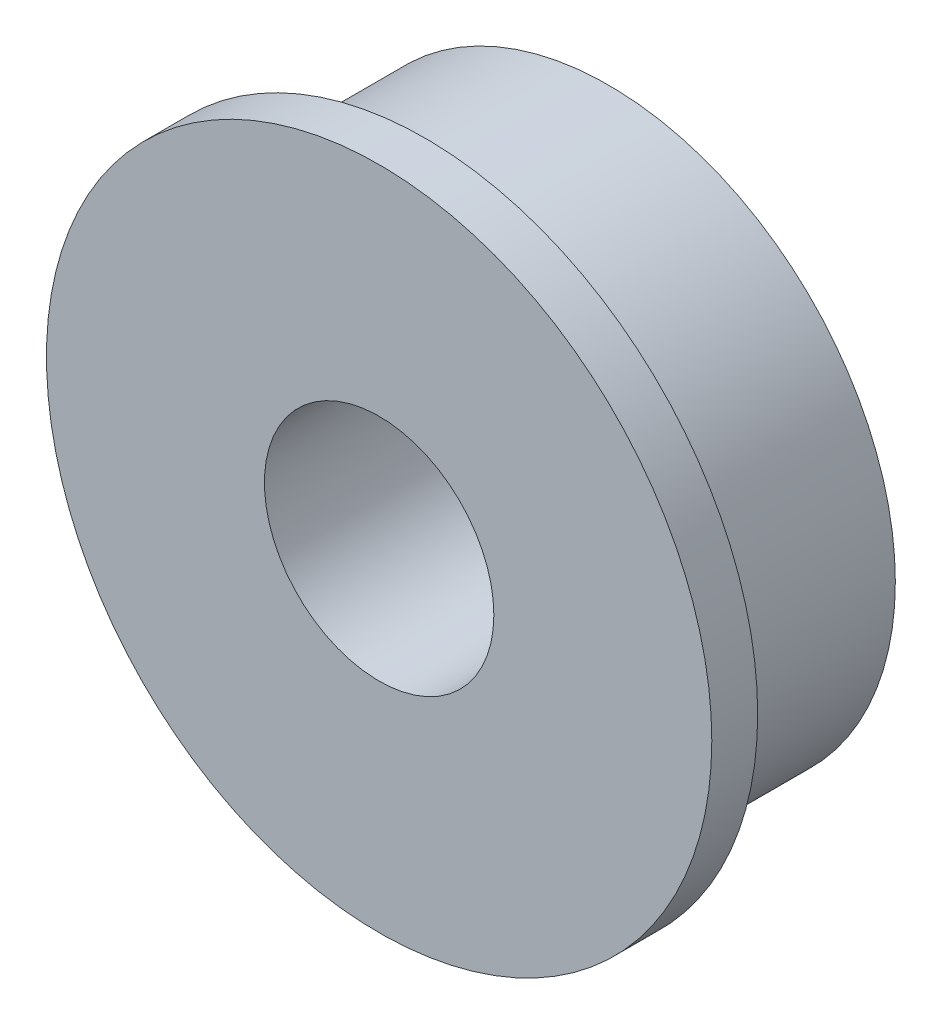
ISO-10303-21;
HEADER;
FILE_DESCRIPTION(('STEP AP214'),'2;1');
FILE_NAME('part.step','',(''),(''),'','','');
FILE_SCHEMA(('AUTOMOTIVE_DESIGN { 1 0 10303 214 1 1 1 1 }'));
ENDSEC;
DATA;
#1=APPLICATION_CONTEXT('core data for automotive mechanical design processes');
#2=APPLICATION_PROTOCOL_DEFINITION('international standard','automotive_design',2000,#1);
#3=PRODUCT_CONTEXT('',#1,'mechanical');
#4=PRODUCT('Part','Part','',(#3));
#5=PRODUCT_RELATED_PRODUCT_CATEGORY('part','',(#4));
#6=PRODUCT_DEFINITION_FORMATION('','',#4);
#7=PRODUCT_DEFINITION_CONTEXT('part definition',#1,'design');
#8=PRODUCT_DEFINITION('design','',#6,#7);
#9=PRODUCT_DEFINITION_SHAPE('','',#8);
#10=(LENGTH_UNIT() NAMED_UNIT(*) SI_UNIT(.MILLI.,.METRE.));
#11=(NAMED_UNIT(*) PLANE_ANGLE_UNIT() SI_UNIT($,.RADIAN.));
#12=(NAMED_UNIT(*) SI_UNIT($,.STERADIAN.) SOLID_ANGLE_UNIT());
#13=UNCERTAINTY_MEASURE_WITH_UNIT(LENGTH_MEASURE(1.E-05),#10,'distance_accuracy_value','');
#14=(GEOMETRIC_REPRESENTATION_CONTEXT(3) GLOBAL_UNCERTAINTY_ASSIGNED_CONTEXT((#13)) GLOBAL_UNIT_ASSIGNED_CONTEXT((#10,
#11,#12)) REPRESENTATION_CONTEXT('',''));
#15=CARTESIAN_POINT('',(0.,0.,0.));
#16=DIRECTION('',(0.,0.,1.));
#17=DIRECTION('',(1.,0.,0.));
#18=AXIS2_PLACEMENT_3D('',#15,#16,#17);
#19=CARTESIAN_POINT('',(0.,0.,4.));
#20=DIRECTION('',(0.,0.,-1.));
#21=DIRECTION('',(-1.,0.,0.));
#22=AXIS2_PLACEMENT_3D('',#19,#20,#21);
#23=CYLINDRICAL_SURFACE('',#22,5.);
#24=CARTESIAN_POINT('',(0.,0.,0.));
#25=DIRECTION('',(0.,0.,1.));
#26=DIRECTION('',(1.,0.,0.));
#27=AXIS2_PLACEMENT_3D('',#24,#25,#26);
#28=CIRCLE('',#27,5.);
#29=CARTESIAN_POINT('',(5.,0.,0.));
#30=VERTEX_POINT('',#29);
#31=EDGE_CURVE('E42',#30,#30,#28,.T.);
#32=ORIENTED_EDGE('',*,*,#31,.T.);
#33=EDGE_LOOP('',(#32));
#34=FACE_BOUND('',#33,.T.);
#35=CARTESIAN_POINT('',(0.,0.,3.2));
#36=DIRECTION('',(0.,0.,1.));
#37=DIRECTION('',(1.,0.,0.));
#38=AXIS2_PLACEMENT_3D('',#35,#36,#37);
#39=CIRCLE('',#38,5.);
#40=CARTESIAN_POINT('',(5.,0.,3.2));
#41=VERTEX_POINT('',#40);
#42=EDGE_CURVE('E10',#41,#41,#39,.T.);
#43=ORIENTED_EDGE('',*,*,#42,.F.);
#44=EDGE_LOOP('',(#43));
#45=FACE_BOUND('',#44,.T.);
#46=ADVANCED_FACE('F39',(#34,#45),#23,.T.);
#47=CARTESIAN_POINT('',(0.,0.,4.));
#48=DIRECTION('',(0.,0.,1.));
#49=DIRECTION('',(1.,0.,0.));
#50=AXIS2_PLACEMENT_3D('',#47,#48,#49);
#51=PLANE('',#50);
#52=CARTESIAN_POINT('',(0.,0.,4.));
#53=DIRECTION('',(0.,0.,1.));
#54=DIRECTION('',(1.,0.,0.));
#55=AXIS2_PLACEMENT_3D('',#52,#53,#54);
#56=CIRCLE('',#55,2.);
#57=CARTESIAN_POINT('',(2.,0.,4.));
#58=VERTEX_POINT('',#57);
#59=EDGE_CURVE('E50',#58,#58,#56,.T.);
#60=ORIENTED_EDGE('',*,*,#59,.F.);
#61=EDGE_LOOP('',(#60));
#62=FACE_BOUND('',#61,.T.);
#63=CARTESIAN_POINT('',(0.,0.,4.));
#64=DIRECTION('',(0.,0.,1.));
#65=DIRECTION('',(1.,0.,0.));
#66=AXIS2_PLACEMENT_3D('',#63,#64,#65);
#67=CIRCLE('',#66,5.8);
#68=CARTESIAN_POINT('',(5.8,0.,4.));
#69=VERTEX_POINT('',#68);
#70=EDGE_CURVE('E53',#69,#69,#67,.T.);
#71=ORIENTED_EDGE('',*,*,#70,.T.);
#72=EDGE_LOOP('',(#71));
#73=FACE_BOUND('',#72,.T.);
#74=ADVANCED_FACE('F67',(#62,#73),#51,.T.);
#75=CARTESIAN_POINT('',(0.,0.,0.));
#76=DIRECTION('',(0.,0.,1.));
#77=DIRECTION('',(1.,0.,0.));
#78=AXIS2_PLACEMENT_3D('',#75,#76,#77);
#79=PLANE('',#78);
#80=ORIENTED_EDGE('',*,*,#31,.F.);
#81=EDGE_LOOP('',(#80));
#82=FACE_BOUND('',#81,.T.);
#83=CARTESIAN_POINT('',(0.,0.,0.));
#84=DIRECTION('',(0.,0.,1.));
#85=DIRECTION('',(1.,0.,0.));
#86=AXIS2_PLACEMENT_3D('',#83,#84,#85);
#87=CIRCLE('',#86,2.);
#88=CARTESIAN_POINT('',(2.,0.,0.));
#89=VERTEX_POINT('',#88);
#90=EDGE_CURVE('E56',#89,#89,#87,.T.);
#91=ORIENTED_EDGE('',*,*,#90,.T.);
#92=EDGE_LOOP('',(#91));
#93=FACE_BOUND('',#92,.T.);
#94=ADVANCED_FACE('F86',(#82,#93),#79,.F.);
#95=CARTESIAN_POINT('',(0.,0.,4.));
#96=DIRECTION('',(0.,0.,-1.));
#97=DIRECTION('',(-1.,0.,0.));
#98=AXIS2_PLACEMENT_3D('',#95,#96,#97);
#99=CYLINDRICAL_SURFACE('',#98,2.);
#100=ORIENTED_EDGE('',*,*,#59,.T.);
#101=EDGE_LOOP('',(#100));
#102=FACE_BOUND('',#101,.T.);
#103=ORIENTED_EDGE('',*,*,#90,.F.);
#104=EDGE_LOOP('',(#103));
#105=FACE_BOUND('',#104,.T.);
#106=ADVANCED_FACE('F76',(#102,#105),#99,.F.);
#107=CARTESIAN_POINT('',(0.,0.,3.2));
#108=DIRECTION('',(0.,0.,1.));
#109=DIRECTION('',(1.,0.,0.));
#110=AXIS2_PLACEMENT_3D('',#107,#108,#109);
#111=PLANE('',#110);
#112=CARTESIAN_POINT('',(0.,0.,3.2));
#113=DIRECTION('',(0.,0.,1.));
#114=DIRECTION('',(1.,0.,0.));
#115=AXIS2_PLACEMENT_3D('',#112,#113,#114);
#116=CIRCLE('',#115,5.8);
#117=CARTESIAN_POINT('',(5.8,0.,3.2));
#118=VERTEX_POINT('',#117);
#119=EDGE_CURVE('E58',#118,#118,#116,.T.);
#120=ORIENTED_EDGE('',*,*,#119,.F.);
#121=EDGE_LOOP('',(#120));
#122=FACE_BOUND('',#121,.T.);
#123=ORIENTED_EDGE('',*,*,#42,.T.);
#124=EDGE_LOOP('',(#123));
#125=FACE_BOUND('',#124,.T.);
#126=ADVANCED_FACE('F71',(#122,#125),#111,.F.);
#127=CARTESIAN_POINT('',(0.,0.,3.2));
#128=DIRECTION('',(0.,0.,1.));
#129=DIRECTION('',(1.,0.,0.));
#130=AXIS2_PLACEMENT_3D('',#127,#128,#129);
#131=CYLINDRICAL_SURFACE('',#130,5.8);
#132=ORIENTED_EDGE('',*,*,#119,.T.);
#133=EDGE_LOOP('',(#132));
#134=FACE_BOUND('',#133,.T.);
#135=ORIENTED_EDGE('',*,*,#70,.F.);
#136=EDGE_LOOP('',(#135));
#137=FACE_BOUND('',#136,.T.);
#138=ADVANCED_FACE('F69',(#134,#137),#131,.T.);
#139=CLOSED_SHELL('',(#46,#74,#94,#106,#126,#138));
#140=MANIFOLD_SOLID_BREP('B2',#139);
#141=ADVANCED_BREP_SHAPE_REPRESENTATION('',(#18,#140),#14);
#142=SHAPE_DEFINITION_REPRESENTATION(#9,#141);
ENDSEC;
END-ISO-10303-21;
